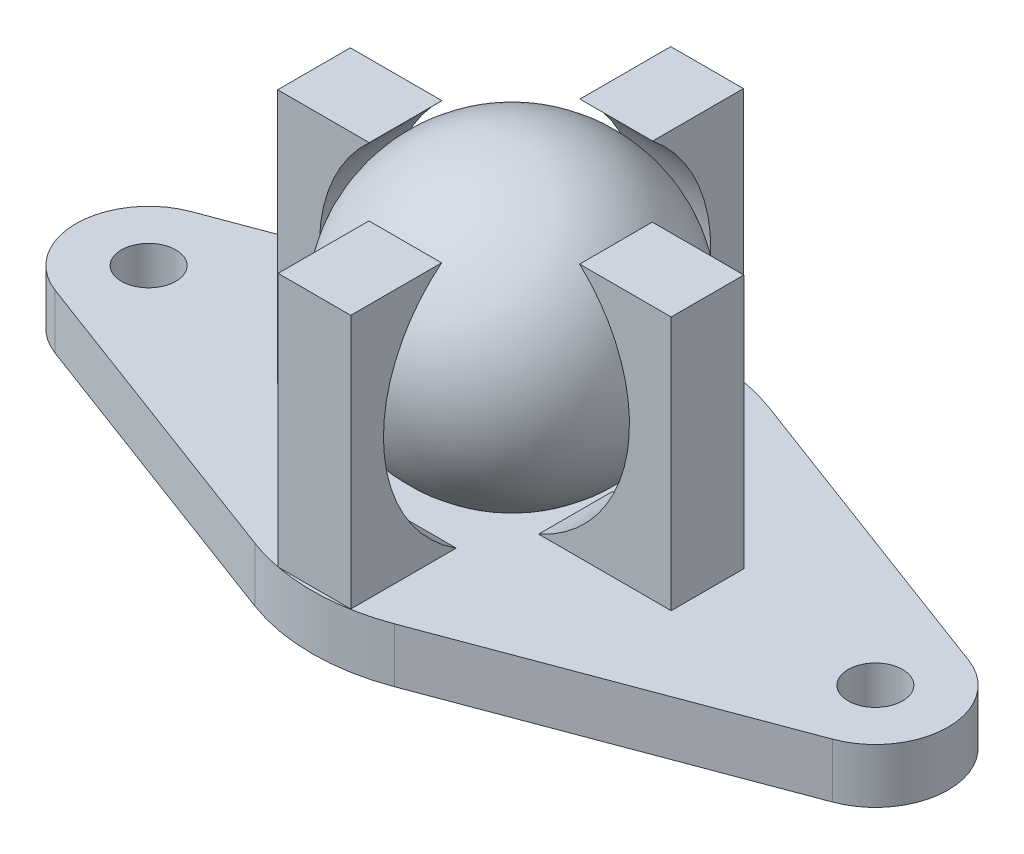
ISO-10303-21;
HEADER;
FILE_DESCRIPTION(('STEP AP214'),'2;1');
FILE_NAME('part.step','',(''),(''),'','','');
FILE_SCHEMA(('AUTOMOTIVE_DESIGN { 1 0 10303 214 1 1 1 1 }'));
ENDSEC;
DATA;
#1=APPLICATION_CONTEXT('core data for automotive mechanical design processes');
#2=APPLICATION_PROTOCOL_DEFINITION('international standard','automotive_design',2000,#1);
#3=PRODUCT_CONTEXT('',#1,'mechanical');
#4=PRODUCT('Part','Part','',(#3));
#5=PRODUCT_RELATED_PRODUCT_CATEGORY('part','',(#4));
#6=PRODUCT_DEFINITION_FORMATION('','',#4);
#7=PRODUCT_DEFINITION_CONTEXT('part definition',#1,'design');
#8=PRODUCT_DEFINITION('design','',#6,#7);
#9=PRODUCT_DEFINITION_SHAPE('','',#8);
#10=(LENGTH_UNIT() NAMED_UNIT(*) SI_UNIT(.MILLI.,.METRE.));
#11=(NAMED_UNIT(*) PLANE_ANGLE_UNIT() SI_UNIT($,.RADIAN.));
#12=(NAMED_UNIT(*) SI_UNIT($,.STERADIAN.) SOLID_ANGLE_UNIT());
#13=UNCERTAINTY_MEASURE_WITH_UNIT(LENGTH_MEASURE(1.E-05),#10,'distance_accuracy_value','');
#14=(GEOMETRIC_REPRESENTATION_CONTEXT(3) GLOBAL_UNCERTAINTY_ASSIGNED_CONTEXT((#13)) GLOBAL_UNIT_ASSIGNED_CONTEXT((#10,
#11,#12)) REPRESENTATION_CONTEXT('',''));
#15=CARTESIAN_POINT('',(0.,0.,0.));
#16=DIRECTION('',(0.,0.,1.));
#17=DIRECTION('',(1.,0.,0.));
#18=AXIS2_PLACEMENT_3D('',#15,#16,#17);
#19=CARTESIAN_POINT('',(0.,11.,0.));
#20=DIRECTION('',(0.,-1.,0.));
#21=DIRECTION('',(-1.,0.,0.));
#22=AXIS2_PLACEMENT_3D('',#19,#20,#21);
#23=SPHERICAL_SURFACE('',#22,8.);
#24=CARTESIAN_POINT('',(0.,3.,0.));
#25=VERTEX_POINT('',#24);
#26=VERTEX_LOOP('',#25);
#27=FACE_BOUND('',#26,.T.);
#28=ADVANCED_FACE('F43',(#27),#23,.T.);
#29=CLOSED_SHELL('',(#28));
#30=MANIFOLD_SOLID_BREP('B2',#29);
#31=CARTESIAN_POINT('',(0.,3.,0.));
#32=DIRECTION('',(0.,1.,0.));
#33=DIRECTION('',(0.,0.,1.));
#34=AXIS2_PLACEMENT_3D('',#31,#32,#33);
#35=PLANE('',#34);
#36=CARTESIAN_POINT('',(0.,3.,0.));
#37=VERTEX_POINT('',#36);
#38=VERTEX_LOOP('',#37);
#39=FACE_BOUND('',#38,.T.);
#40=DIRECTION('',(-1.,0.,0.));
#41=VECTOR('',#40,1.);
#42=CARTESIAN_POINT('',(1.93230371044806,3.,10.8068625878673));
#43=LINE('',#42,#41);
#44=CARTESIAN_POINT('',(1.93230371044806,3.,10.8068625878673));
#45=VERTEX_POINT('',#44);
#46=CARTESIAN_POINT('',(-2.05224779375063,3.,10.8068625878673));
#47=VERTEX_POINT('',#46);
#48=EDGE_CURVE('E381',#45,#47,#43,.T.);
#49=ORIENTED_EDGE('',*,*,#48,.T.);
#50=CARTESIAN_POINT('',(0.,3.,0.));
#51=DIRECTION('',(0.,1.,0.));
#52=DIRECTION('',(0.,0.,1.));
#53=AXIS2_PLACEMENT_3D('',#50,#51,#52);
#54=CIRCLE('',#53,11.);
#55=CARTESIAN_POINT('',(3.85,3.,10.3042466973574));
#56=VERTEX_POINT('',#55);
#57=EDGE_CURVE('E427',#47,#56,#54,.T.);
#58=ORIENTED_EDGE('',*,*,#57,.T.);
#59=DIRECTION('',(0.93674969975976,0.,-0.35));
#60=VECTOR('',#59,1.);
#61=CARTESIAN_POINT('',(3.85,3.,10.3042466973574));
#62=LINE('',#61,#60);
#63=CARTESIAN_POINT('',(21.4,3.,3.74699879903904));
#64=VERTEX_POINT('',#63);
#65=EDGE_CURVE('E558',#56,#64,#62,.T.);
#66=ORIENTED_EDGE('',*,*,#65,.T.);
#67=CARTESIAN_POINT('',(20.,3.,0.));
#68=DIRECTION('',(0.,1.,0.));
#69=DIRECTION('',(0.,0.,1.));
#70=AXIS2_PLACEMENT_3D('',#67,#68,#69);
#71=CIRCLE('',#70,4.);
#72=CARTESIAN_POINT('',(21.4,3.,-3.74699879903904));
#73=VERTEX_POINT('',#72);
#74=EDGE_CURVE('E560',#64,#73,#71,.T.);
#75=ORIENTED_EDGE('',*,*,#74,.T.);
#76=DIRECTION('',(-0.93674969975976,0.,-0.35));
#77=VECTOR('',#76,1.);
#78=CARTESIAN_POINT('',(3.85,3.,-10.3042466973574));
#79=LINE('',#78,#77);
#80=CARTESIAN_POINT('',(3.85,3.,-10.3042466973574));
#81=VERTEX_POINT('',#80);
#82=EDGE_CURVE('E534',#73,#81,#79,.T.);
#83=ORIENTED_EDGE('',*,*,#82,.T.);
#84=CARTESIAN_POINT('',(0.,3.,0.));
#85=DIRECTION('',(0.,1.,0.));
#86=DIRECTION('',(0.,0.,1.));
#87=AXIS2_PLACEMENT_3D('',#84,#85,#86);
#88=CIRCLE('',#87,11.);
#89=CARTESIAN_POINT('',(-2.05224779375065,3.,-10.8068625878673));
#90=VERTEX_POINT('',#89);
#91=EDGE_CURVE('E575',#81,#90,#88,.T.);
#92=ORIENTED_EDGE('',*,*,#91,.T.);
#93=DIRECTION('',(-1.,0.,0.));
#94=VECTOR('',#93,1.);
#95=CARTESIAN_POINT('',(1.93230371044806,3.,-10.8068625878673));
#96=LINE('',#95,#94);
#97=CARTESIAN_POINT('',(1.93230371044806,3.,-10.8068625878673));
#98=VERTEX_POINT('',#97);
#99=EDGE_CURVE('E393',#98,#90,#96,.T.);
#100=ORIENTED_EDGE('',*,*,#99,.F.);
#101=DIRECTION('',(0.,0.,1.));
#102=VECTOR('',#101,1.);
#103=CARTESIAN_POINT('',(1.93230371044806,3.,-10.8068625878673));
#104=LINE('',#103,#102);
#105=CARTESIAN_POINT('',(1.93230371044806,3.,-5.00105453121258));
#106=VERTEX_POINT('',#105);
#107=EDGE_CURVE('E592',#98,#106,#104,.T.);
#108=ORIENTED_EDGE('',*,*,#107,.T.);
#109=DIRECTION('',(-1.,0.,0.));
#110=VECTOR('',#109,1.);
#111=CARTESIAN_POINT('',(1.93230371044806,3.,-5.00105453121258));
#112=LINE('',#111,#110);
#113=CARTESIAN_POINT('',(-2.06769628955194,3.,-5.00105453121258));
#114=VERTEX_POINT('',#113);
#115=EDGE_CURVE('E597',#106,#114,#112,.T.);
#116=ORIENTED_EDGE('',*,*,#115,.T.);
#117=DIRECTION('',(0.,0.,1.));
#118=VECTOR('',#117,1.);
#119=CARTESIAN_POINT('',(-2.06769628955194,3.,-10.8068625878673));
#120=LINE('',#119,#118);
#121=CARTESIAN_POINT('',(-2.06769628955194,3.,-10.8039174401776));
#122=VERTEX_POINT('',#121);
#123=EDGE_CURVE('E41',#122,#114,#120,.T.);
#124=ORIENTED_EDGE('',*,*,#123,.F.);
#125=CARTESIAN_POINT('',(-3.85,3.,-10.3042466973574));
#126=VERTEX_POINT('',#125);
#127=EDGE_CURVE('E529',#122,#126,#88,.T.);
#128=ORIENTED_EDGE('',*,*,#127,.T.);
#129=DIRECTION('',(-0.93674969975976,0.,0.35));
#130=VECTOR('',#129,1.);
#131=CARTESIAN_POINT('',(-3.85,3.,-10.3042466973574));
#132=LINE('',#131,#130);
#133=CARTESIAN_POINT('',(-21.4,3.,-3.74699879903904));
#134=VERTEX_POINT('',#133);
#135=EDGE_CURVE('E554',#126,#134,#132,.T.);
#136=ORIENTED_EDGE('',*,*,#135,.T.);
#137=CARTESIAN_POINT('',(-20.,3.,0.));
#138=DIRECTION('',(0.,1.,0.));
#139=DIRECTION('',(0.,0.,-1.));
#140=AXIS2_PLACEMENT_3D('',#137,#138,#139);
#141=CIRCLE('',#140,4.);
#142=CARTESIAN_POINT('',(-21.4,3.,3.74699879903904));
#143=VERTEX_POINT('',#142);
#144=EDGE_CURVE('E510',#134,#143,#141,.T.);
#145=ORIENTED_EDGE('',*,*,#144,.T.);
#146=DIRECTION('',(0.93674969975976,0.,0.35));
#147=VECTOR('',#146,1.);
#148=CARTESIAN_POINT('',(-3.85,3.,10.3042466973574));
#149=LINE('',#148,#147);
#150=CARTESIAN_POINT('',(-3.85000000000001,3.,10.3042466973574));
#151=VERTEX_POINT('',#150);
#152=EDGE_CURVE('E548',#143,#151,#149,.T.);
#153=ORIENTED_EDGE('',*,*,#152,.T.);
#154=CARTESIAN_POINT('',(-2.06769628955194,3.,10.8039174401776));
#155=VERTEX_POINT('',#154);
#156=EDGE_CURVE('E553',#151,#155,#54,.T.);
#157=ORIENTED_EDGE('',*,*,#156,.T.);
#158=DIRECTION('',(0.,0.,1.));
#159=VECTOR('',#158,1.);
#160=CARTESIAN_POINT('',(-2.06769628955194,3.,10.8068625878673));
#161=LINE('',#160,#159);
#162=CARTESIAN_POINT('',(-2.06769628955194,3.,5.00105453121258));
#163=VERTEX_POINT('',#162);
#164=EDGE_CURVE('E363',#163,#155,#161,.T.);
#165=ORIENTED_EDGE('',*,*,#164,.F.);
#166=DIRECTION('',(-1.,0.,0.));
#167=VECTOR('',#166,1.);
#168=CARTESIAN_POINT('',(1.93230371044806,3.,5.00105453121258));
#169=LINE('',#168,#167);
#170=CARTESIAN_POINT('',(1.93230371044806,3.,5.00105453121258));
#171=VERTEX_POINT('',#170);
#172=EDGE_CURVE('E359',#171,#163,#169,.T.);
#173=ORIENTED_EDGE('',*,*,#172,.F.);
#174=DIRECTION('',(0.,0.,1.));
#175=VECTOR('',#174,1.);
#176=CARTESIAN_POINT('',(1.93230371044806,3.,10.8068625878673));
#177=LINE('',#176,#175);
#178=EDGE_CURVE('E362',#171,#45,#177,.T.);
#179=ORIENTED_EDGE('',*,*,#178,.T.);
#180=EDGE_LOOP('',(#49,#58,#66,#75,#83,#92,#100,#108,#116,#124,#128,#136,#145,#153,#157,#165,
#173,#179));
#181=FACE_BOUND('',#180,.T.);
#182=CARTESIAN_POINT('',(20.,3.,0.));
#183=DIRECTION('',(0.,1.,0.));
#184=DIRECTION('',(0.,0.,1.));
#185=AXIS2_PLACEMENT_3D('',#182,#183,#184);
#186=CIRCLE('',#185,1.5);
#187=CARTESIAN_POINT('',(20.,3.,1.5));
#188=VERTEX_POINT('',#187);
#189=EDGE_CURVE('E562',#188,#188,#186,.T.);
#190=ORIENTED_EDGE('',*,*,#189,.F.);
#191=EDGE_LOOP('',(#190));
#192=FACE_BOUND('',#191,.T.);
#193=CARTESIAN_POINT('',(-20.,3.,0.));
#194=DIRECTION('',(0.,1.,0.));
#195=DIRECTION('',(0.,0.,-1.));
#196=AXIS2_PLACEMENT_3D('',#193,#194,#195);
#197=CIRCLE('',#196,1.5);
#198=CARTESIAN_POINT('',(-20.,3.,-1.5));
#199=VERTEX_POINT('',#198);
#200=EDGE_CURVE('E569',#199,#199,#197,.T.);
#201=ORIENTED_EDGE('',*,*,#200,.F.);
#202=EDGE_LOOP('',(#201));
#203=FACE_BOUND('',#202,.T.);
#204=DIRECTION('',(-1.,0.,0.));
#205=VECTOR('',#204,1.);
#206=CARTESIAN_POINT('',(10.8289520439694,3.,-1.93230371044802));
#207=LINE('',#206,#205);
#208=CARTESIAN_POINT('',(10.8289520439694,3.,-1.93230371044802));
#209=VERTEX_POINT('',#208);
#210=CARTESIAN_POINT('',(3.53188266611562,3.,-1.93230371044802));
#211=VERTEX_POINT('',#210);
#212=EDGE_CURVE('E297',#209,#211,#207,.T.);
#213=ORIENTED_EDGE('',*,*,#212,.F.);
#214=DIRECTION('',(0.,0.,1.));
#215=VECTOR('',#214,1.);
#216=CARTESIAN_POINT('',(10.8289520439694,3.,-1.93230371044802));
#217=LINE('',#216,#215);
#218=CARTESIAN_POINT('',(10.8289520439694,3.,2.06769628955198));
#219=VERTEX_POINT('',#218);
#220=EDGE_CURVE('E285',#209,#219,#217,.T.);
#221=ORIENTED_EDGE('',*,*,#220,.T.);
#222=DIRECTION('',(-1.,0.,0.));
#223=VECTOR('',#222,1.);
#224=CARTESIAN_POINT('',(10.8289520439694,3.,2.06769628955198));
#225=LINE('',#224,#223);
#226=CARTESIAN_POINT('',(3.53188266611562,3.,2.06769628955198));
#227=VERTEX_POINT('',#226);
#228=EDGE_CURVE('E300',#219,#227,#225,.T.);
#229=ORIENTED_EDGE('',*,*,#228,.T.);
#230=DIRECTION('',(0.,0.,1.));
#231=VECTOR('',#230,1.);
#232=CARTESIAN_POINT('',(3.53188266611562,3.,-1.93230371044802));
#233=LINE('',#232,#231);
#234=EDGE_CURVE('E303',#211,#227,#233,.T.);
#235=ORIENTED_EDGE('',*,*,#234,.F.);
#236=EDGE_LOOP('',(#213,#221,#229,#235));
#237=FACE_BOUND('',#236,.T.);
#238=DIRECTION('',(-1.,0.,0.));
#239=VECTOR('',#238,1.);
#240=CARTESIAN_POINT('',(-10.8289520439694,3.,2.06769628955198));
#241=LINE('',#240,#239);
#242=CARTESIAN_POINT('',(-3.53188266611562,3.,2.06769628955198));
#243=VERTEX_POINT('',#242);
#244=CARTESIAN_POINT('',(-10.8289520439694,3.,2.06769628955198));
#245=VERTEX_POINT('',#244);
#246=EDGE_CURVE('E72',#243,#245,#241,.T.);
#247=ORIENTED_EDGE('',*,*,#246,.T.);
#248=DIRECTION('',(0.,0.,1.));
#249=VECTOR('',#248,1.);
#250=CARTESIAN_POINT('',(-10.8289520439694,3.,-1.93230371044802));
#251=LINE('',#250,#249);
#252=CARTESIAN_POINT('',(-10.8289520439694,3.,-1.93230371044802));
#253=VERTEX_POINT('',#252);
#254=EDGE_CURVE('E251',#253,#245,#251,.T.);
#255=ORIENTED_EDGE('',*,*,#254,.F.);
#256=DIRECTION('',(-1.,0.,0.));
#257=VECTOR('',#256,1.);
#258=CARTESIAN_POINT('',(-10.8289520439694,3.,-1.93230371044802));
#259=LINE('',#258,#257);
#260=CARTESIAN_POINT('',(-3.53188266611562,3.,-1.93230371044802));
#261=VERTEX_POINT('',#260);
#262=EDGE_CURVE('E240',#261,#253,#259,.T.);
#263=ORIENTED_EDGE('',*,*,#262,.F.);
#264=DIRECTION('',(0.,0.,1.));
#265=VECTOR('',#264,1.);
#266=CARTESIAN_POINT('',(-3.53188266611562,3.,-1.93230371044802));
#267=LINE('',#266,#265);
#268=EDGE_CURVE('E231',#261,#243,#267,.T.);
#269=ORIENTED_EDGE('',*,*,#268,.T.);
#270=EDGE_LOOP('',(#247,#255,#263,#269));
#271=FACE_BOUND('',#270,.T.);
#272=ADVANCED_FACE('F56',(#39,#181,#192,#203,#237,#271),#35,.T.);
#273=CARTESIAN_POINT('',(0.,0.,0.));
#274=DIRECTION('',(0.,1.,0.));
#275=DIRECTION('',(0.,0.,1.));
#276=AXIS2_PLACEMENT_3D('',#273,#274,#275);
#277=PLANE('',#276);
#278=CARTESIAN_POINT('',(0.,0.,0.));
#279=DIRECTION('',(0.,1.,0.));
#280=DIRECTION('',(0.,0.,1.));
#281=AXIS2_PLACEMENT_3D('',#278,#279,#280);
#282=CIRCLE('',#281,11.);
#283=CARTESIAN_POINT('',(3.85,0.,-10.3042466973574));
#284=VERTEX_POINT('',#283);
#285=CARTESIAN_POINT('',(-3.85,0.,-10.3042466973574));
#286=VERTEX_POINT('',#285);
#287=EDGE_CURVE('E506',#284,#286,#282,.T.);
#288=ORIENTED_EDGE('',*,*,#287,.F.);
#289=DIRECTION('',(-0.93674969975976,0.,-0.35));
#290=VECTOR('',#289,1.);
#291=CARTESIAN_POINT('',(3.85,0.,-10.3042466973574));
#292=LINE('',#291,#290);
#293=CARTESIAN_POINT('',(21.4,0.,-3.74699879903904));
#294=VERTEX_POINT('',#293);
#295=EDGE_CURVE('E527',#294,#284,#292,.T.);
#296=ORIENTED_EDGE('',*,*,#295,.F.);
#297=CARTESIAN_POINT('',(20.,0.,0.));
#298=DIRECTION('',(0.,1.,0.));
#299=DIRECTION('',(0.,0.,1.));
#300=AXIS2_PLACEMENT_3D('',#297,#298,#299);
#301=CIRCLE('',#300,4.);
#302=CARTESIAN_POINT('',(21.4,0.,3.74699879903904));
#303=VERTEX_POINT('',#302);
#304=EDGE_CURVE('E525',#303,#294,#301,.T.);
#305=ORIENTED_EDGE('',*,*,#304,.F.);
#306=DIRECTION('',(0.93674969975976,0.,-0.35));
#307=VECTOR('',#306,1.);
#308=CARTESIAN_POINT('',(3.85,0.,10.3042466973574));
#309=LINE('',#308,#307);
#310=CARTESIAN_POINT('',(3.85,0.,10.3042466973574));
#311=VERTEX_POINT('',#310);
#312=EDGE_CURVE('E523',#311,#303,#309,.T.);
#313=ORIENTED_EDGE('',*,*,#312,.F.);
#314=CARTESIAN_POINT('',(0.,0.,0.));
#315=DIRECTION('',(0.,1.,0.));
#316=DIRECTION('',(0.,0.,1.));
#317=AXIS2_PLACEMENT_3D('',#314,#315,#316);
#318=CIRCLE('',#317,11.);
#319=CARTESIAN_POINT('',(-3.85000000000001,0.,10.3042466973574));
#320=VERTEX_POINT('',#319);
#321=EDGE_CURVE('E518',#320,#311,#318,.T.);
#322=ORIENTED_EDGE('',*,*,#321,.F.);
#323=DIRECTION('',(0.93674969975976,0.,0.35));
#324=VECTOR('',#323,1.);
#325=CARTESIAN_POINT('',(-3.85,0.,10.3042466973574));
#326=LINE('',#325,#324);
#327=CARTESIAN_POINT('',(-21.4,0.,3.74699879903904));
#328=VERTEX_POINT('',#327);
#329=EDGE_CURVE('E516',#328,#320,#326,.T.);
#330=ORIENTED_EDGE('',*,*,#329,.F.);
#331=CARTESIAN_POINT('',(-20.,0.,0.));
#332=DIRECTION('',(0.,1.,0.));
#333=DIRECTION('',(0.,0.,-1.));
#334=AXIS2_PLACEMENT_3D('',#331,#332,#333);
#335=CIRCLE('',#334,4.);
#336=CARTESIAN_POINT('',(-21.4,0.,-3.74699879903904));
#337=VERTEX_POINT('',#336);
#338=EDGE_CURVE('E505',#337,#328,#335,.T.);
#339=ORIENTED_EDGE('',*,*,#338,.F.);
#340=DIRECTION('',(-0.93674969975976,0.,0.35));
#341=VECTOR('',#340,1.);
#342=CARTESIAN_POINT('',(-3.85,0.,-10.3042466973574));
#343=LINE('',#342,#341);
#344=EDGE_CURVE('E496',#286,#337,#343,.T.);
#345=ORIENTED_EDGE('',*,*,#344,.F.);
#346=EDGE_LOOP('',(#288,#296,#305,#313,#322,#330,#339,#345));
#347=FACE_BOUND('',#346,.T.);
#348=CARTESIAN_POINT('',(20.,0.,0.));
#349=DIRECTION('',(0.,1.,0.));
#350=DIRECTION('',(0.,0.,1.));
#351=AXIS2_PLACEMENT_3D('',#348,#349,#350);
#352=CIRCLE('',#351,1.5);
#353=CARTESIAN_POINT('',(20.,0.,1.5));
#354=VERTEX_POINT('',#353);
#355=EDGE_CURVE('E564',#354,#354,#352,.T.);
#356=ORIENTED_EDGE('',*,*,#355,.T.);
#357=EDGE_LOOP('',(#356));
#358=FACE_BOUND('',#357,.T.);
#359=CARTESIAN_POINT('',(-20.,0.,0.));
#360=DIRECTION('',(0.,1.,0.));
#361=DIRECTION('',(0.,0.,-1.));
#362=AXIS2_PLACEMENT_3D('',#359,#360,#361);
#363=CIRCLE('',#362,1.5);
#364=CARTESIAN_POINT('',(-20.,0.,-1.5));
#365=VERTEX_POINT('',#364);
#366=EDGE_CURVE('E572',#365,#365,#363,.T.);
#367=ORIENTED_EDGE('',*,*,#366,.T.);
#368=EDGE_LOOP('',(#367));
#369=FACE_BOUND('',#368,.T.);
#370=ADVANCED_FACE('F453',(#347,#358,#369),#277,.F.);
#371=CARTESIAN_POINT('',(0.,3.,0.));
#372=DIRECTION('',(0.,-1.,0.));
#373=DIRECTION('',(0.,0.,-1.));
#374=AXIS2_PLACEMENT_3D('',#371,#372,#373);
#375=CYLINDRICAL_SURFACE('',#374,11.);
#376=ORIENTED_EDGE('',*,*,#287,.T.);
#377=DIRECTION('',(0.,-1.,0.));
#378=VECTOR('',#377,1.);
#379=CARTESIAN_POINT('',(-3.85,3.,-10.3042466973574));
#380=LINE('',#379,#378);
#381=EDGE_CURVE('E65',#126,#286,#380,.T.);
#382=ORIENTED_EDGE('',*,*,#381,.F.);
#383=ORIENTED_EDGE('',*,*,#127,.F.);
#384=EDGE_CURVE('E577',#90,#122,#88,.T.);
#385=ORIENTED_EDGE('',*,*,#384,.F.);
#386=ORIENTED_EDGE('',*,*,#91,.F.);
#387=DIRECTION('',(0.,-1.,0.));
#388=VECTOR('',#387,1.);
#389=CARTESIAN_POINT('',(3.85,3.,-10.3042466973574));
#390=LINE('',#389,#388);
#391=EDGE_CURVE('E530',#81,#284,#390,.T.);
#392=ORIENTED_EDGE('',*,*,#391,.T.);
#393=EDGE_LOOP('',(#376,#382,#383,#385,#386,#392));
#394=FACE_BOUND('',#393,.T.);
#395=ADVANCED_FACE('F58',(#394),#375,.T.);
#396=CARTESIAN_POINT('',(-3.85,3.,-10.3042466973574));
#397=DIRECTION('',(0.35,0.,0.93674969975976));
#398=DIRECTION('',(0.93674969975976,0.,-0.35));
#399=AXIS2_PLACEMENT_3D('',#396,#397,#398);
#400=PLANE('',#399);
#401=ORIENTED_EDGE('',*,*,#344,.T.);
#402=DIRECTION('',(0.,-1.,0.));
#403=VECTOR('',#402,1.);
#404=CARTESIAN_POINT('',(-21.4,3.,-3.74699879903904));
#405=LINE('',#404,#403);
#406=EDGE_CURVE('E499',#134,#337,#405,.T.);
#407=ORIENTED_EDGE('',*,*,#406,.F.);
#408=ORIENTED_EDGE('',*,*,#135,.F.);
#409=ORIENTED_EDGE('',*,*,#381,.T.);
#410=EDGE_LOOP('',(#401,#407,#408,#409));
#411=FACE_BOUND('',#410,.T.);
#412=ADVANCED_FACE('F486',(#411),#400,.F.);
#413=CARTESIAN_POINT('',(-20.,3.,0.));
#414=DIRECTION('',(0.,-1.,0.));
#415=DIRECTION('',(0.,0.,-1.));
#416=AXIS2_PLACEMENT_3D('',#413,#414,#415);
#417=CYLINDRICAL_SURFACE('',#416,4.);
#418=ORIENTED_EDGE('',*,*,#338,.T.);
#419=DIRECTION('',(0.,-1.,0.));
#420=VECTOR('',#419,1.);
#421=CARTESIAN_POINT('',(-21.4,3.,3.74699879903904));
#422=LINE('',#421,#420);
#423=EDGE_CURVE('E511',#143,#328,#422,.T.);
#424=ORIENTED_EDGE('',*,*,#423,.F.);
#425=ORIENTED_EDGE('',*,*,#144,.F.);
#426=ORIENTED_EDGE('',*,*,#406,.T.);
#427=EDGE_LOOP('',(#418,#424,#425,#426));
#428=FACE_BOUND('',#427,.T.);
#429=ADVANCED_FACE('F483',(#428),#417,.T.);
#430=CARTESIAN_POINT('',(-3.85,3.,10.3042466973574));
#431=DIRECTION('',(0.35,0.,-0.93674969975976));
#432=DIRECTION('',(-0.93674969975976,0.,-0.35));
#433=AXIS2_PLACEMENT_3D('',#430,#431,#432);
#434=PLANE('',#433);
#435=ORIENTED_EDGE('',*,*,#329,.T.);
#436=DIRECTION('',(0.,-1.,0.));
#437=VECTOR('',#436,1.);
#438=CARTESIAN_POINT('',(-3.85000000000001,3.,10.3042466973574));
#439=LINE('',#438,#437);
#440=EDGE_CURVE('E543',#151,#320,#439,.T.);
#441=ORIENTED_EDGE('',*,*,#440,.F.);
#442=ORIENTED_EDGE('',*,*,#152,.F.);
#443=ORIENTED_EDGE('',*,*,#423,.T.);
#444=EDGE_LOOP('',(#435,#441,#442,#443));
#445=FACE_BOUND('',#444,.T.);
#446=ADVANCED_FACE('F479',(#445),#434,.F.);
#447=CARTESIAN_POINT('',(0.,3.,0.));
#448=DIRECTION('',(0.,-1.,0.));
#449=DIRECTION('',(0.,0.,-1.));
#450=AXIS2_PLACEMENT_3D('',#447,#448,#449);
#451=CYLINDRICAL_SURFACE('',#450,11.);
#452=ORIENTED_EDGE('',*,*,#321,.T.);
#453=DIRECTION('',(0.,-1.,0.));
#454=VECTOR('',#453,1.);
#455=CARTESIAN_POINT('',(3.85,3.,10.3042466973574));
#456=LINE('',#455,#454);
#457=EDGE_CURVE('E540',#56,#311,#456,.T.);
#458=ORIENTED_EDGE('',*,*,#457,.F.);
#459=ORIENTED_EDGE('',*,*,#57,.F.);
#460=EDGE_CURVE('E423',#155,#47,#54,.T.);
#461=ORIENTED_EDGE('',*,*,#460,.F.);
#462=ORIENTED_EDGE('',*,*,#156,.F.);
#463=ORIENTED_EDGE('',*,*,#440,.T.);
#464=EDGE_LOOP('',(#452,#458,#459,#461,#462,#463));
#465=FACE_BOUND('',#464,.T.);
#466=ADVANCED_FACE('F475',(#465),#451,.T.);
#467=CARTESIAN_POINT('',(3.85,3.,10.3042466973574));
#468=DIRECTION('',(-0.35,0.,-0.93674969975976));
#469=DIRECTION('',(-0.93674969975976,0.,0.35));
#470=AXIS2_PLACEMENT_3D('',#467,#468,#469);
#471=PLANE('',#470);
#472=ORIENTED_EDGE('',*,*,#312,.T.);
#473=DIRECTION('',(0.,-1.,0.));
#474=VECTOR('',#473,1.);
#475=CARTESIAN_POINT('',(21.4,3.,3.74699879903904));
#476=LINE('',#475,#474);
#477=EDGE_CURVE('E537',#64,#303,#476,.T.);
#478=ORIENTED_EDGE('',*,*,#477,.F.);
#479=ORIENTED_EDGE('',*,*,#65,.F.);
#480=ORIENTED_EDGE('',*,*,#457,.T.);
#481=EDGE_LOOP('',(#472,#478,#479,#480));
#482=FACE_BOUND('',#481,.T.);
#483=ADVANCED_FACE('F471',(#482),#471,.F.);
#484=CARTESIAN_POINT('',(20.,3.,0.));
#485=DIRECTION('',(0.,-1.,0.));
#486=DIRECTION('',(0.,0.,-1.));
#487=AXIS2_PLACEMENT_3D('',#484,#485,#486);
#488=CYLINDRICAL_SURFACE('',#487,4.);
#489=ORIENTED_EDGE('',*,*,#304,.T.);
#490=DIRECTION('',(0.,-1.,0.));
#491=VECTOR('',#490,1.);
#492=CARTESIAN_POINT('',(21.4,3.,-3.74699879903904));
#493=LINE('',#492,#491);
#494=EDGE_CURVE('E533',#73,#294,#493,.T.);
#495=ORIENTED_EDGE('',*,*,#494,.F.);
#496=ORIENTED_EDGE('',*,*,#74,.F.);
#497=ORIENTED_EDGE('',*,*,#477,.T.);
#498=EDGE_LOOP('',(#489,#495,#496,#497));
#499=FACE_BOUND('',#498,.T.);
#500=ADVANCED_FACE('F467',(#499),#488,.T.);
#501=CARTESIAN_POINT('',(3.85,3.,-10.3042466973574));
#502=DIRECTION('',(-0.35,0.,0.93674969975976));
#503=DIRECTION('',(0.93674969975976,0.,0.35));
#504=AXIS2_PLACEMENT_3D('',#501,#502,#503);
#505=PLANE('',#504);
#506=ORIENTED_EDGE('',*,*,#295,.T.);
#507=ORIENTED_EDGE('',*,*,#391,.F.);
#508=ORIENTED_EDGE('',*,*,#82,.F.);
#509=ORIENTED_EDGE('',*,*,#494,.T.);
#510=EDGE_LOOP('',(#506,#507,#508,#509));
#511=FACE_BOUND('',#510,.T.);
#512=ADVANCED_FACE('F464',(#511),#505,.F.);
#513=CARTESIAN_POINT('',(20.,3.,0.));
#514=DIRECTION('',(0.,-1.,0.));
#515=DIRECTION('',(0.,0.,-1.));
#516=AXIS2_PLACEMENT_3D('',#513,#514,#515);
#517=CYLINDRICAL_SURFACE('',#516,1.5);
#518=ORIENTED_EDGE('',*,*,#189,.T.);
#519=EDGE_LOOP('',(#518));
#520=FACE_BOUND('',#519,.T.);
#521=ORIENTED_EDGE('',*,*,#355,.F.);
#522=EDGE_LOOP('',(#521));
#523=FACE_BOUND('',#522,.T.);
#524=ADVANCED_FACE('F461',(#520,#523),#517,.F.);
#525=CARTESIAN_POINT('',(-20.,3.,0.));
#526=DIRECTION('',(0.,-1.,0.));
#527=DIRECTION('',(0.,0.,-1.));
#528=AXIS2_PLACEMENT_3D('',#525,#526,#527);
#529=CYLINDRICAL_SURFACE('',#528,1.5);
#530=ORIENTED_EDGE('',*,*,#200,.T.);
#531=EDGE_LOOP('',(#530));
#532=FACE_BOUND('',#531,.T.);
#533=ORIENTED_EDGE('',*,*,#366,.F.);
#534=EDGE_LOOP('',(#533));
#535=FACE_BOUND('',#534,.T.);
#536=ADVANCED_FACE('F449',(#532,#535),#529,.F.);
#537=CARTESIAN_POINT('',(-2.06769628955194,0.,0.));
#538=DIRECTION('',(-1.,0.,0.));
#539=DIRECTION('',(0.,0.,1.));
#540=AXIS2_PLACEMENT_3D('',#537,#538,#539);
#541=PLANE('',#540);
#542=DIRECTION('',(0.,-1.,0.));
#543=VECTOR('',#542,1.);
#544=CARTESIAN_POINT('',(-2.06769628955194,3.,-10.8068625878673));
#545=LINE('',#544,#543);
#546=CARTESIAN_POINT('',(-2.06769628955194,17.,-10.8068625878673));
#547=VERTEX_POINT('',#546);
#548=CARTESIAN_POINT('',(-2.06769628955194,3.,-10.8068625878673));
#549=VERTEX_POINT('',#548);
#550=EDGE_CURVE('E355',#547,#549,#545,.T.);
#551=ORIENTED_EDGE('',*,*,#550,.T.);
#552=EDGE_CURVE('E586',#549,#122,#120,.T.);
#553=ORIENTED_EDGE('',*,*,#552,.T.);
#554=ORIENTED_EDGE('',*,*,#123,.T.);
#555=CARTESIAN_POINT('',(-2.06769628955194,10.2896462531787,-0.371683800043483));
#556=DIRECTION('',(1.,0.,0.));
#557=DIRECTION('',(0.,1.,0.));
#558=AXIS2_PLACEMENT_3D('',#555,#556,#557);
#559=CIRCLE('',#558,8.63539320836567);
#560=CARTESIAN_POINT('',(-2.06769628955194,17.,-5.80686258786729));
#561=VERTEX_POINT('',#560);
#562=EDGE_CURVE('E601',#114,#561,#559,.T.);
#563=ORIENTED_EDGE('',*,*,#562,.T.);
#564=DIRECTION('',(0.,0.,-1.));
#565=VECTOR('',#564,1.);
#566=CARTESIAN_POINT('',(-2.06769628955194,17.,-10.8068625878673));
#567=LINE('',#566,#565);
#568=EDGE_CURVE('E625',#561,#547,#567,.T.);
#569=ORIENTED_EDGE('',*,*,#568,.T.);
#570=EDGE_LOOP('',(#551,#553,#554,#563,#569));
#571=FACE_BOUND('',#570,.T.);
#572=ADVANCED_FACE('F437',(#571),#541,.T.);
#573=CARTESIAN_POINT('',(1.93230371044806,0.,0.));
#574=DIRECTION('',(-1.,0.,0.));
#575=DIRECTION('',(0.,0.,1.));
#576=AXIS2_PLACEMENT_3D('',#573,#574,#575);
#577=PLANE('',#576);
#578=DIRECTION('',(0.,-1.,0.));
#579=VECTOR('',#578,1.);
#580=CARTESIAN_POINT('',(1.93230371044806,3.,-10.8068625878673));
#581=LINE('',#580,#579);
#582=CARTESIAN_POINT('',(1.93230371044806,17.,-10.8068625878673));
#583=VERTEX_POINT('',#582);
#584=EDGE_CURVE('E637',#583,#98,#581,.T.);
#585=ORIENTED_EDGE('',*,*,#584,.F.);
#586=DIRECTION('',(0.,0.,-1.));
#587=VECTOR('',#586,1.);
#588=CARTESIAN_POINT('',(1.93230371044806,17.,-10.8068625878673));
#589=LINE('',#588,#587);
#590=CARTESIAN_POINT('',(1.93230371044806,17.,-5.80686258786729));
#591=VERTEX_POINT('',#590);
#592=EDGE_CURVE('E604',#591,#583,#589,.T.);
#593=ORIENTED_EDGE('',*,*,#592,.F.);
#594=CARTESIAN_POINT('',(1.93230371044806,10.2896462531787,-0.371683800043483));
#595=DIRECTION('',(1.,0.,0.));
#596=DIRECTION('',(0.,1.,0.));
#597=AXIS2_PLACEMENT_3D('',#594,#595,#596);
#598=CIRCLE('',#597,8.63539320836567);
#599=EDGE_CURVE('E593',#106,#591,#598,.T.);
#600=ORIENTED_EDGE('',*,*,#599,.F.);
#601=ORIENTED_EDGE('',*,*,#107,.F.);
#602=EDGE_LOOP('',(#585,#593,#600,#601));
#603=FACE_BOUND('',#602,.T.);
#604=ADVANCED_FACE('F448',(#603),#577,.F.);
#605=CARTESIAN_POINT('',(1.93230371044806,3.,-10.8068625878673));
#606=DIRECTION('',(0.,0.,-1.));
#607=DIRECTION('',(0.,1.,0.));
#608=AXIS2_PLACEMENT_3D('',#605,#606,#607);
#609=PLANE('',#608);
#610=ORIENTED_EDGE('',*,*,#550,.F.);
#611=DIRECTION('',(-1.,0.,0.));
#612=VECTOR('',#611,1.);
#613=CARTESIAN_POINT('',(1.93230371044806,17.,-10.8068625878673));
#614=LINE('',#613,#612);
#615=EDGE_CURVE('E615',#583,#547,#614,.T.);
#616=ORIENTED_EDGE('',*,*,#615,.F.);
#617=ORIENTED_EDGE('',*,*,#584,.T.);
#618=ORIENTED_EDGE('',*,*,#99,.T.);
#619=EDGE_CURVE('E587',#90,#549,#96,.T.);
#620=ORIENTED_EDGE('',*,*,#619,.T.);
#621=EDGE_LOOP('',(#610,#616,#617,#618,#620));
#622=FACE_BOUND('',#621,.T.);
#623=ADVANCED_FACE('F829',(#622),#609,.T.);
#624=CARTESIAN_POINT('',(1.93230371044806,17.,-10.8068625878673));
#625=DIRECTION('',(0.,1.,0.));
#626=DIRECTION('',(0.,0.,1.));
#627=AXIS2_PLACEMENT_3D('',#624,#625,#626);
#628=PLANE('',#627);
#629=ORIENTED_EDGE('',*,*,#568,.F.);
#630=DIRECTION('',(-1.,0.,0.));
#631=VECTOR('',#630,1.);
#632=CARTESIAN_POINT('',(1.93230371044806,17.,-5.80686258786729));
#633=LINE('',#632,#631);
#634=EDGE_CURVE('E622',#591,#561,#633,.T.);
#635=ORIENTED_EDGE('',*,*,#634,.F.);
#636=ORIENTED_EDGE('',*,*,#592,.T.);
#637=ORIENTED_EDGE('',*,*,#615,.T.);
#638=EDGE_LOOP('',(#629,#635,#636,#637));
#639=FACE_BOUND('',#638,.T.);
#640=ADVANCED_FACE('F821',(#639),#628,.T.);
#641=CARTESIAN_POINT('',(1.93230371044806,10.2896462531787,-0.371683800043483));
#642=DIRECTION('',(-1.,0.,0.));
#643=DIRECTION('',(0.,0.,1.));
#644=AXIS2_PLACEMENT_3D('',#641,#642,#643);
#645=CYLINDRICAL_SURFACE('',#644,8.63539320836567);
#646=ORIENTED_EDGE('',*,*,#562,.F.);
#647=ORIENTED_EDGE('',*,*,#115,.F.);
#648=ORIENTED_EDGE('',*,*,#599,.T.);
#649=ORIENTED_EDGE('',*,*,#634,.T.);
#650=EDGE_LOOP('',(#646,#647,#648,#649));
#651=FACE_BOUND('',#650,.T.);
#652=ADVANCED_FACE('F813',(#651),#645,.F.);
#653=CARTESIAN_POINT('',(1.93230371044806,3.,-10.8068625878673));
#654=DIRECTION('',(0.,-1.,0.));
#655=DIRECTION('',(0.,0.,-1.));
#656=AXIS2_PLACEMENT_3D('',#653,#654,#655);
#657=PLANE('',#656);
#658=ORIENTED_EDGE('',*,*,#619,.F.);
#659=ORIENTED_EDGE('',*,*,#384,.T.);
#660=ORIENTED_EDGE('',*,*,#552,.F.);
#661=EDGE_LOOP('',(#658,#659,#660));
#662=FACE_BOUND('',#661,.T.);
#663=ADVANCED_FACE('F585',(#662),#657,.T.);
#664=CARTESIAN_POINT('',(-2.06769628955194,0.,0.));
#665=DIRECTION('',(-1.,0.,0.));
#666=DIRECTION('',(0.,0.,1.));
#667=AXIS2_PLACEMENT_3D('',#664,#665,#666);
#668=PLANE('',#667);
#669=DIRECTION('',(0.,0.,-1.));
#670=VECTOR('',#669,1.);
#671=CARTESIAN_POINT('',(-2.06769628955194,17.,10.8068625878673));
#672=LINE('',#671,#670);
#673=CARTESIAN_POINT('',(-2.06769628955194,17.,10.8068625878673));
#674=VERTEX_POINT('',#673);
#675=CARTESIAN_POINT('',(-2.06769628955194,17.,5.80686258786729));
#676=VERTEX_POINT('',#675);
#677=EDGE_CURVE('E299',#674,#676,#672,.T.);
#678=ORIENTED_EDGE('',*,*,#677,.T.);
#679=CARTESIAN_POINT('',(-2.06769628955194,10.2896462531787,0.371683800043483));
#680=DIRECTION('',(1.,0.,0.));
#681=DIRECTION('',(0.,1.,0.));
#682=AXIS2_PLACEMENT_3D('',#679,#680,#681);
#683=CIRCLE('',#682,8.63539320836567);
#684=EDGE_CURVE('E356',#676,#163,#683,.T.);
#685=ORIENTED_EDGE('',*,*,#684,.T.);
#686=ORIENTED_EDGE('',*,*,#164,.T.);
#687=CARTESIAN_POINT('',(-2.06769628955194,3.,10.8068625878673));
#688=VERTEX_POINT('',#687);
#689=EDGE_CURVE('E378',#155,#688,#161,.T.);
#690=ORIENTED_EDGE('',*,*,#689,.T.);
#691=DIRECTION('',(0.,1.,0.));
#692=VECTOR('',#691,1.);
#693=CARTESIAN_POINT('',(-2.06769628955194,3.,10.8068625878673));
#694=LINE('',#693,#692);
#695=EDGE_CURVE('E343',#688,#674,#694,.T.);
#696=ORIENTED_EDGE('',*,*,#695,.T.);
#697=EDGE_LOOP('',(#678,#685,#686,#690,#696));
#698=FACE_BOUND('',#697,.T.);
#699=ADVANCED_FACE('F418',(#698),#668,.T.);
#700=CARTESIAN_POINT('',(1.93230371044806,0.,0.));
#701=DIRECTION('',(-1.,0.,0.));
#702=DIRECTION('',(0.,0.,1.));
#703=AXIS2_PLACEMENT_3D('',#700,#701,#702);
#704=PLANE('',#703);
#705=DIRECTION('',(0.,0.,-1.));
#706=VECTOR('',#705,1.);
#707=CARTESIAN_POINT('',(1.93230371044806,17.,10.8068625878673));
#708=LINE('',#707,#706);
#709=CARTESIAN_POINT('',(1.93230371044806,17.,10.8068625878673));
#710=VERTEX_POINT('',#709);
#711=CARTESIAN_POINT('',(1.93230371044806,17.,5.80686258786729));
#712=VERTEX_POINT('',#711);
#713=EDGE_CURVE('E344',#710,#712,#708,.T.);
#714=ORIENTED_EDGE('',*,*,#713,.F.);
#715=DIRECTION('',(0.,1.,0.));
#716=VECTOR('',#715,1.);
#717=CARTESIAN_POINT('',(1.93230371044806,3.,10.8068625878673));
#718=LINE('',#717,#716);
#719=EDGE_CURVE('E388',#45,#710,#718,.T.);
#720=ORIENTED_EDGE('',*,*,#719,.F.);
#721=ORIENTED_EDGE('',*,*,#178,.F.);
#722=CARTESIAN_POINT('',(1.93230371044806,10.2896462531787,0.371683800043483));
#723=DIRECTION('',(1.,0.,0.));
#724=DIRECTION('',(0.,1.,0.));
#725=AXIS2_PLACEMENT_3D('',#722,#723,#724);
#726=CIRCLE('',#725,8.63539320836567);
#727=EDGE_CURVE('E352',#712,#171,#726,.T.);
#728=ORIENTED_EDGE('',*,*,#727,.F.);
#729=EDGE_LOOP('',(#714,#720,#721,#728));
#730=FACE_BOUND('',#729,.T.);
#731=ADVANCED_FACE('F431',(#730),#704,.F.);
#732=CARTESIAN_POINT('',(1.93230371044806,17.,10.8068625878673));
#733=DIRECTION('',(0.,1.,0.));
#734=DIRECTION('',(0.,0.,1.));
#735=AXIS2_PLACEMENT_3D('',#732,#733,#734);
#736=PLANE('',#735);
#737=ORIENTED_EDGE('',*,*,#677,.F.);
#738=DIRECTION('',(-1.,0.,0.));
#739=VECTOR('',#738,1.);
#740=CARTESIAN_POINT('',(1.93230371044806,17.,10.8068625878673));
#741=LINE('',#740,#739);
#742=EDGE_CURVE('E349',#710,#674,#741,.T.);
#743=ORIENTED_EDGE('',*,*,#742,.F.);
#744=ORIENTED_EDGE('',*,*,#713,.T.);
#745=DIRECTION('',(-1.,0.,0.));
#746=VECTOR('',#745,1.);
#747=CARTESIAN_POINT('',(1.93230371044806,17.,5.80686258786729));
#748=LINE('',#747,#746);
#749=EDGE_CURVE('E340',#712,#676,#748,.T.);
#750=ORIENTED_EDGE('',*,*,#749,.T.);
#751=EDGE_LOOP('',(#737,#743,#744,#750));
#752=FACE_BOUND('',#751,.T.);
#753=ADVANCED_FACE('F414',(#752),#736,.T.);
#754=CARTESIAN_POINT('',(1.93230371044806,3.,10.8068625878673));
#755=DIRECTION('',(0.,0.,1.));
#756=DIRECTION('',(0.,-1.,0.));
#757=AXIS2_PLACEMENT_3D('',#754,#755,#756);
#758=PLANE('',#757);
#759=ORIENTED_EDGE('',*,*,#695,.F.);
#760=EDGE_CURVE('E391',#47,#688,#43,.T.);
#761=ORIENTED_EDGE('',*,*,#760,.F.);
#762=ORIENTED_EDGE('',*,*,#48,.F.);
#763=ORIENTED_EDGE('',*,*,#719,.T.);
#764=ORIENTED_EDGE('',*,*,#742,.T.);
#765=EDGE_LOOP('',(#759,#761,#762,#763,#764));
#766=FACE_BOUND('',#765,.T.);
#767=ADVANCED_FACE('F409',(#766),#758,.T.);
#768=CARTESIAN_POINT('',(1.93230371044806,3.,10.8068625878673));
#769=DIRECTION('',(0.,-1.,0.));
#770=DIRECTION('',(0.,0.,-1.));
#771=AXIS2_PLACEMENT_3D('',#768,#769,#770);
#772=PLANE('',#771);
#773=ORIENTED_EDGE('',*,*,#460,.T.);
#774=ORIENTED_EDGE('',*,*,#760,.T.);
#775=ORIENTED_EDGE('',*,*,#689,.F.);
#776=EDGE_LOOP('',(#773,#774,#775));
#777=FACE_BOUND('',#776,.T.);
#778=ADVANCED_FACE('F422',(#777),#772,.T.);
#779=CARTESIAN_POINT('',(1.93230371044806,10.2896462531787,0.371683800043483));
#780=DIRECTION('',(-1.,0.,0.));
#781=DIRECTION('',(0.,0.,1.));
#782=AXIS2_PLACEMENT_3D('',#779,#780,#781);
#783=CYLINDRICAL_SURFACE('',#782,8.63539320836567);
#784=ORIENTED_EDGE('',*,*,#684,.F.);
#785=ORIENTED_EDGE('',*,*,#749,.F.);
#786=ORIENTED_EDGE('',*,*,#727,.T.);
#787=ORIENTED_EDGE('',*,*,#172,.T.);
#788=EDGE_LOOP('',(#784,#785,#786,#787));
#789=FACE_BOUND('',#788,.T.);
#790=ADVANCED_FACE('F433',(#789),#783,.F.);
#791=CARTESIAN_POINT('',(0.,0.,2.06769628955198));
#792=DIRECTION('',(0.,0.,1.));
#793=DIRECTION('',(1.,0.,0.));
#794=AXIS2_PLACEMENT_3D('',#791,#792,#793);
#795=PLANE('',#794);
#796=ORIENTED_EDGE('',*,*,#228,.F.);
#797=DIRECTION('',(0.,-1.,0.));
#798=VECTOR('',#797,1.);
#799=CARTESIAN_POINT('',(10.8289520439694,3.,2.06769628955198));
#800=LINE('',#799,#798);
#801=CARTESIAN_POINT('',(10.8289520439694,17.,2.06769628955198));
#802=VERTEX_POINT('',#801);
#803=EDGE_CURVE('E249',#802,#219,#800,.T.);
#804=ORIENTED_EDGE('',*,*,#803,.F.);
#805=DIRECTION('',(1.,0.,0.));
#806=VECTOR('',#805,1.);
#807=CARTESIAN_POINT('',(10.8289520439694,17.,2.06769628955198));
#808=LINE('',#807,#806);
#809=CARTESIAN_POINT('',(5.78923981765911,17.,2.06769628955198));
#810=VERTEX_POINT('',#809);
#811=EDGE_CURVE('E288',#810,#802,#808,.T.);
#812=ORIENTED_EDGE('',*,*,#811,.F.);
#813=CARTESIAN_POINT('',(0.0323386956677081,10.7462536616888,2.06769628955198));
#814=DIRECTION('',(0.,0.,1.));
#815=DIRECTION('',(1.,0.,0.));
#816=AXIS2_PLACEMENT_3D('',#813,#814,#815);
#817=CIRCLE('',#816,8.50007375216981);
#818=EDGE_CURVE('E306',#227,#810,#817,.T.);
#819=ORIENTED_EDGE('',*,*,#818,.F.);
#820=EDGE_LOOP('',(#796,#804,#812,#819));
#821=FACE_BOUND('',#820,.T.);
#822=ADVANCED_FACE('F435',(#821),#795,.T.);
#823=CARTESIAN_POINT('',(0.,0.,-1.93230371044803));
#824=DIRECTION('',(0.,0.,1.));
#825=DIRECTION('',(1.,0.,0.));
#826=AXIS2_PLACEMENT_3D('',#823,#824,#825);
#827=PLANE('',#826);
#828=ORIENTED_EDGE('',*,*,#212,.T.);
#829=CARTESIAN_POINT('',(0.0323386956677081,10.7462536616888,-1.93230371044802));
#830=DIRECTION('',(0.,0.,1.));
#831=DIRECTION('',(1.,0.,0.));
#832=AXIS2_PLACEMENT_3D('',#829,#830,#831);
#833=CIRCLE('',#832,8.50007375216981);
#834=CARTESIAN_POINT('',(5.78923981765911,17.,-1.93230371044802));
#835=VERTEX_POINT('',#834);
#836=EDGE_CURVE('E305',#211,#835,#833,.T.);
#837=ORIENTED_EDGE('',*,*,#836,.T.);
#838=DIRECTION('',(1.,0.,0.));
#839=VECTOR('',#838,1.);
#840=CARTESIAN_POINT('',(10.8289520439694,17.,-1.93230371044802));
#841=LINE('',#840,#839);
#842=CARTESIAN_POINT('',(10.8289520439694,17.,-1.93230371044802));
#843=VERTEX_POINT('',#842);
#844=EDGE_CURVE('E321',#835,#843,#841,.T.);
#845=ORIENTED_EDGE('',*,*,#844,.T.);
#846=DIRECTION('',(0.,-1.,0.));
#847=VECTOR('',#846,1.);
#848=CARTESIAN_POINT('',(10.8289520439694,3.,-1.93230371044802));
#849=LINE('',#848,#847);
#850=EDGE_CURVE('E289',#843,#209,#849,.T.);
#851=ORIENTED_EDGE('',*,*,#850,.T.);
#852=EDGE_LOOP('',(#828,#837,#845,#851));
#853=FACE_BOUND('',#852,.T.);
#854=ADVANCED_FACE('F442',(#853),#827,.F.);
#855=CARTESIAN_POINT('',(10.8289520439694,3.,-1.93230371044802));
#856=DIRECTION('',(-1.,0.,0.));
#857=DIRECTION('',(0.,0.,1.));
#858=AXIS2_PLACEMENT_3D('',#855,#856,#857);
#859=PLANE('',#858);
#860=ORIENTED_EDGE('',*,*,#803,.T.);
#861=ORIENTED_EDGE('',*,*,#220,.F.);
#862=ORIENTED_EDGE('',*,*,#850,.F.);
#863=DIRECTION('',(0.,0.,1.));
#864=VECTOR('',#863,1.);
#865=CARTESIAN_POINT('',(10.8289520439694,17.,-1.93230371044802));
#866=LINE('',#865,#864);
#867=EDGE_CURVE('E294',#843,#802,#866,.T.);
#868=ORIENTED_EDGE('',*,*,#867,.T.);
#869=EDGE_LOOP('',(#860,#861,#862,#868));
#870=FACE_BOUND('',#869,.T.);
#871=ADVANCED_FACE('F670',(#870),#859,.F.);
#872=CARTESIAN_POINT('',(10.8289520439694,17.,-1.93230371044802));
#873=DIRECTION('',(0.,-1.,0.));
#874=DIRECTION('',(0.,0.,-1.));
#875=AXIS2_PLACEMENT_3D('',#872,#873,#874);
#876=PLANE('',#875);
#877=ORIENTED_EDGE('',*,*,#811,.T.);
#878=ORIENTED_EDGE('',*,*,#867,.F.);
#879=ORIENTED_EDGE('',*,*,#844,.F.);
#880=DIRECTION('',(0.,0.,1.));
#881=VECTOR('',#880,1.);
#882=CARTESIAN_POINT('',(5.78923981765911,17.,-1.93230371044802));
#883=LINE('',#882,#881);
#884=EDGE_CURVE('E324',#835,#810,#883,.T.);
#885=ORIENTED_EDGE('',*,*,#884,.T.);
#886=EDGE_LOOP('',(#877,#878,#879,#885));
#887=FACE_BOUND('',#886,.T.);
#888=ADVANCED_FACE('F665',(#887),#876,.F.);
#889=CARTESIAN_POINT('',(0.0323386956677081,10.7462536616888,-1.93230371044802));
#890=DIRECTION('',(0.,0.,1.));
#891=DIRECTION('',(1.,0.,0.));
#892=AXIS2_PLACEMENT_3D('',#889,#890,#891);
#893=CYLINDRICAL_SURFACE('',#892,8.50007375216981);
#894=ORIENTED_EDGE('',*,*,#818,.T.);
#895=ORIENTED_EDGE('',*,*,#884,.F.);
#896=ORIENTED_EDGE('',*,*,#836,.F.);
#897=ORIENTED_EDGE('',*,*,#234,.T.);
#898=EDGE_LOOP('',(#894,#895,#896,#897));
#899=FACE_BOUND('',#898,.T.);
#900=ADVANCED_FACE('F661',(#899),#893,.F.);
#901=CARTESIAN_POINT('',(0.,0.,2.06769628955198));
#902=DIRECTION('',(0.,0.,1.));
#903=DIRECTION('',(1.,0.,0.));
#904=AXIS2_PLACEMENT_3D('',#901,#902,#903);
#905=PLANE('',#904);
#906=CARTESIAN_POINT('',(-0.0323386956677081,10.7462536616888,2.06769628955198));
#907=DIRECTION('',(0.,0.,1.));
#908=DIRECTION('',(1.,0.,0.));
#909=AXIS2_PLACEMENT_3D('',#906,#907,#908);
#910=CIRCLE('',#909,8.50007375216981);
#911=CARTESIAN_POINT('',(-5.78923981765911,17.,2.06769628955198));
#912=VERTEX_POINT('',#911);
#913=EDGE_CURVE('E237',#912,#243,#910,.T.);
#914=ORIENTED_EDGE('',*,*,#913,.F.);
#915=DIRECTION('',(1.,0.,0.));
#916=VECTOR('',#915,1.);
#917=CARTESIAN_POINT('',(-10.8289520439694,17.,2.06769628955198));
#918=LINE('',#917,#916);
#919=CARTESIAN_POINT('',(-10.8289520439694,17.,2.06769628955198));
#920=VERTEX_POINT('',#919);
#921=EDGE_CURVE('E259',#920,#912,#918,.T.);
#922=ORIENTED_EDGE('',*,*,#921,.F.);
#923=DIRECTION('',(0.,1.,0.));
#924=VECTOR('',#923,1.);
#925=CARTESIAN_POINT('',(-10.8289520439694,3.,2.06769628955198));
#926=LINE('',#925,#924);
#927=EDGE_CURVE('E271',#245,#920,#926,.T.);
#928=ORIENTED_EDGE('',*,*,#927,.F.);
#929=ORIENTED_EDGE('',*,*,#246,.F.);
#930=EDGE_LOOP('',(#914,#922,#928,#929));
#931=FACE_BOUND('',#930,.T.);
#932=ADVANCED_FACE('F680',(#931),#905,.T.);
#933=CARTESIAN_POINT('',(0.,0.,-1.93230371044803));
#934=DIRECTION('',(0.,0.,1.));
#935=DIRECTION('',(1.,0.,0.));
#936=AXIS2_PLACEMENT_3D('',#933,#934,#935);
#937=PLANE('',#936);
#938=CARTESIAN_POINT('',(-0.0323386956677081,10.7462536616888,-1.93230371044802));
#939=DIRECTION('',(0.,0.,1.));
#940=DIRECTION('',(1.,0.,0.));
#941=AXIS2_PLACEMENT_3D('',#938,#939,#940);
#942=CIRCLE('',#941,8.50007375216981);
#943=CARTESIAN_POINT('',(-5.78923981765911,17.,-1.93230371044802));
#944=VERTEX_POINT('',#943);
#945=EDGE_CURVE('E235',#944,#261,#942,.T.);
#946=ORIENTED_EDGE('',*,*,#945,.T.);
#947=ORIENTED_EDGE('',*,*,#262,.T.);
#948=DIRECTION('',(0.,1.,0.));
#949=VECTOR('',#948,1.);
#950=CARTESIAN_POINT('',(-10.8289520439694,3.,-1.93230371044802));
#951=LINE('',#950,#949);
#952=CARTESIAN_POINT('',(-10.8289520439694,17.,-1.93230371044802));
#953=VERTEX_POINT('',#952);
#954=EDGE_CURVE('E267',#253,#953,#951,.T.);
#955=ORIENTED_EDGE('',*,*,#954,.T.);
#956=DIRECTION('',(1.,0.,0.));
#957=VECTOR('',#956,1.);
#958=CARTESIAN_POINT('',(-10.8289520439694,17.,-1.93230371044802));
#959=LINE('',#958,#957);
#960=EDGE_CURVE('E248',#953,#944,#959,.T.);
#961=ORIENTED_EDGE('',*,*,#960,.T.);
#962=EDGE_LOOP('',(#946,#947,#955,#961));
#963=FACE_BOUND('',#962,.T.);
#964=ADVANCED_FACE('F245',(#963),#937,.F.);
#965=CARTESIAN_POINT('',(-10.8289520439694,17.,-1.93230371044802));
#966=DIRECTION('',(0.,-1.,0.));
#967=DIRECTION('',(0.,0.,-1.));
#968=AXIS2_PLACEMENT_3D('',#965,#966,#967);
#969=PLANE('',#968);
#970=ORIENTED_EDGE('',*,*,#921,.T.);
#971=DIRECTION('',(0.,0.,1.));
#972=VECTOR('',#971,1.);
#973=CARTESIAN_POINT('',(-5.78923981765911,17.,-1.93230371044802));
#974=LINE('',#973,#972);
#975=EDGE_CURVE('E278',#944,#912,#974,.T.);
#976=ORIENTED_EDGE('',*,*,#975,.F.);
#977=ORIENTED_EDGE('',*,*,#960,.F.);
#978=DIRECTION('',(0.,0.,1.));
#979=VECTOR('',#978,1.);
#980=CARTESIAN_POINT('',(-10.8289520439694,17.,-1.93230371044802));
#981=LINE('',#980,#979);
#982=EDGE_CURVE('E261',#953,#920,#981,.T.);
#983=ORIENTED_EDGE('',*,*,#982,.T.);
#984=EDGE_LOOP('',(#970,#976,#977,#983));
#985=FACE_BOUND('',#984,.T.);
#986=ADVANCED_FACE('F749',(#985),#969,.F.);
#987=CARTESIAN_POINT('',(-10.8289520439694,3.,-1.93230371044802));
#988=DIRECTION('',(1.,0.,0.));
#989=DIRECTION('',(0.,0.,-1.));
#990=AXIS2_PLACEMENT_3D('',#987,#988,#989);
#991=PLANE('',#990);
#992=ORIENTED_EDGE('',*,*,#927,.T.);
#993=ORIENTED_EDGE('',*,*,#982,.F.);
#994=ORIENTED_EDGE('',*,*,#954,.F.);
#995=ORIENTED_EDGE('',*,*,#254,.T.);
#996=EDGE_LOOP('',(#992,#993,#994,#995));
#997=FACE_BOUND('',#996,.T.);
#998=ADVANCED_FACE('F757',(#997),#991,.F.);
#999=CARTESIAN_POINT('',(-0.0323386956677081,10.7462536616888,-1.93230371044802));
#1000=DIRECTION('',(0.,0.,1.));
#1001=DIRECTION('',(1.,0.,0.));
#1002=AXIS2_PLACEMENT_3D('',#999,#1000,#1001);
#1003=CYLINDRICAL_SURFACE('',#1002,8.50007375216981);
#1004=ORIENTED_EDGE('',*,*,#913,.T.);
#1005=ORIENTED_EDGE('',*,*,#268,.F.);
#1006=ORIENTED_EDGE('',*,*,#945,.F.);
#1007=ORIENTED_EDGE('',*,*,#975,.T.);
#1008=EDGE_LOOP('',(#1004,#1005,#1006,#1007));
#1009=FACE_BOUND('',#1008,.T.);
#1010=ADVANCED_FACE('F233',(#1009),#1003,.F.);
#1011=CLOSED_SHELL('',(#272,#370,#395,#412,#429,#446,#466,#483,#500,#512,#524,#536,#572,#604,
#623,#640,#652,#663,#699,#731,#753,#767,#778,#790,#822,#854,#871,#888,#900,#932,#964,#986,#998,#1010));
#1012=MANIFOLD_SOLID_BREP('B7',#1011);
#1013=ADVANCED_BREP_SHAPE_REPRESENTATION('',(#18,#30,#1012),#14);
#1014=SHAPE_DEFINITION_REPRESENTATION(#9,#1013);
ENDSEC;
END-ISO-10303-21;
